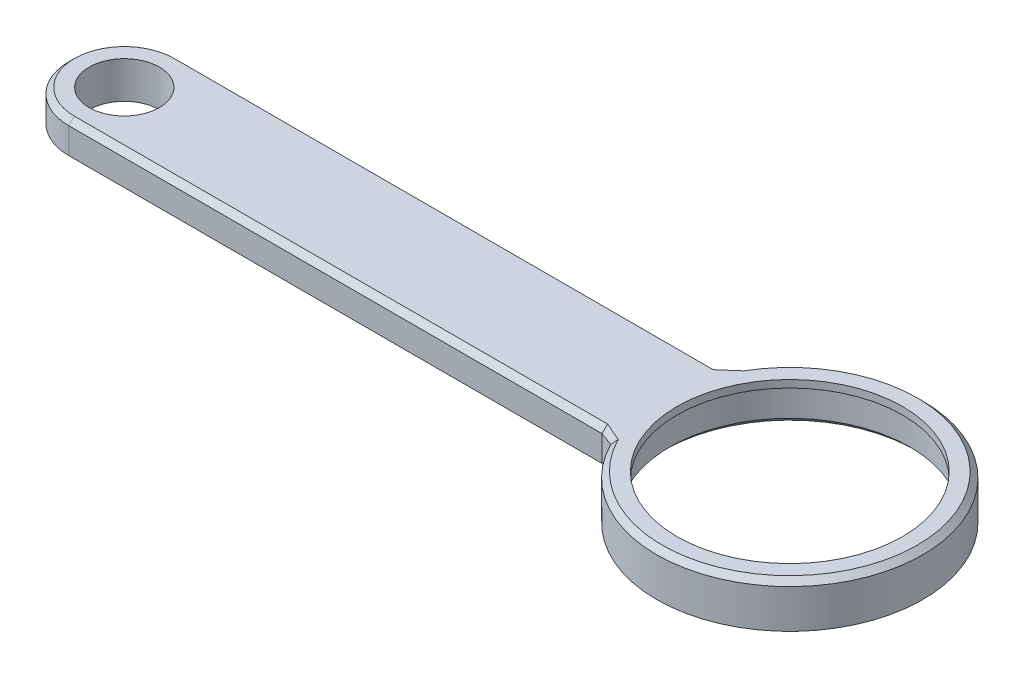
ISO-10303-21;
HEADER;
FILE_DESCRIPTION(('STEP AP214'),'2;1');
FILE_NAME('part.step','',(''),(''),'','','');
FILE_SCHEMA(('AUTOMOTIVE_DESIGN { 1 0 10303 214 1 1 1 1 }'));
ENDSEC;
DATA;
#1=APPLICATION_CONTEXT('core data for automotive mechanical design processes');
#2=APPLICATION_PROTOCOL_DEFINITION('international standard','automotive_design',2000,#1);
#3=PRODUCT_CONTEXT('',#1,'mechanical');
#4=PRODUCT('Part','Part','',(#3));
#5=PRODUCT_RELATED_PRODUCT_CATEGORY('part','',(#4));
#6=PRODUCT_DEFINITION_FORMATION('','',#4);
#7=PRODUCT_DEFINITION_CONTEXT('part definition',#1,'design');
#8=PRODUCT_DEFINITION('design','',#6,#7);
#9=PRODUCT_DEFINITION_SHAPE('','',#8);
#10=(LENGTH_UNIT() NAMED_UNIT(*) SI_UNIT(.MILLI.,.METRE.));
#11=(NAMED_UNIT(*) PLANE_ANGLE_UNIT() SI_UNIT($,.RADIAN.));
#12=(NAMED_UNIT(*) SI_UNIT($,.STERADIAN.) SOLID_ANGLE_UNIT());
#13=UNCERTAINTY_MEASURE_WITH_UNIT(LENGTH_MEASURE(1.E-05),#10,'distance_accuracy_value','');
#14=(GEOMETRIC_REPRESENTATION_CONTEXT(3) GLOBAL_UNCERTAINTY_ASSIGNED_CONTEXT((#13)) GLOBAL_UNIT_ASSIGNED_CONTEXT((#10,
#11,#12)) REPRESENTATION_CONTEXT('',''));
#15=CARTESIAN_POINT('',(0.,0.,0.));
#16=DIRECTION('',(0.,0.,1.));
#17=DIRECTION('',(1.,0.,0.));
#18=AXIS2_PLACEMENT_3D('',#15,#16,#17);
#19=CARTESIAN_POINT('',(0.,0.,0.));
#20=DIRECTION('',(0.,1.,0.));
#21=DIRECTION('',(0.,0.,1.));
#22=AXIS2_PLACEMENT_3D('',#19,#20,#21);
#23=PLANE('',#22);
#24=CARTESIAN_POINT('',(0.,0.,0.));
#25=DIRECTION('',(0.,1.,0.));
#26=DIRECTION('',(0.,0.,1.));
#27=AXIS2_PLACEMENT_3D('',#24,#25,#26);
#28=CIRCLE('',#27,30.5);
#29=CARTESIAN_POINT('',(0.,0.,30.5));
#30=VERTEX_POINT('',#29);
#31=EDGE_CURVE('E279',#30,#30,#28,.T.);
#32=ORIENTED_EDGE('',*,*,#31,.F.);
#33=EDGE_LOOP('',(#32));
#34=FACE_BOUND('',#33,.T.);
#35=CARTESIAN_POINT('',(-180.,0.,0.));
#36=DIRECTION('',(0.,-1.,0.));
#37=DIRECTION('',(0.,0.,-1.));
#38=AXIS2_PLACEMENT_3D('',#35,#36,#37);
#39=CIRCLE('',#38,9.50000000000001);
#40=CARTESIAN_POINT('',(-180.,0.,-9.50000000000001));
#41=VERTEX_POINT('',#40);
#42=EDGE_CURVE('E282',#41,#41,#39,.T.);
#43=ORIENTED_EDGE('',*,*,#42,.T.);
#44=EDGE_LOOP('',(#43));
#45=FACE_BOUND('',#44,.T.);
#46=CARTESIAN_POINT('',(-30.722120826462,0.,15.6971746478235));
#47=CARTESIAN_POINT('',(-31.3705232341037,0.,15.4150854460371));
#48=CARTESIAN_POINT('',(-32.0189256417454,0.,15.1329962442508));
#49=CARTESIAN_POINT('',(-33.1848542865295,0.,14.6257558687203));
#50=CARTESIAN_POINT('',(-33.7023805236719,0.,14.4006046949763));
#51=CARTESIAN_POINT('',(-34.7374329979568,0.,13.9503023474881));
#52=CARTESIAN_POINT('',(-35.2549592350992,0.,13.7251511737441));
#53=CARTESIAN_POINT('',(-35.7724854722417,0.,13.5));
#54=B_SPLINE_CURVE_WITH_KNOTS('',3,(#46,#47,#48,#49,#50,#51,#52,#53),.UNSPECIFIED.,.F.,.F.,(4,2,
2,4),(0.,2.12132034355963,3.81446478941247,5.50760923526531),.UNSPECIFIED.);
#55=CARTESIAN_POINT('',(-30.722120826462,0.,15.6971746478235));
#56=VERTEX_POINT('',#55);
#57=CARTESIAN_POINT('',(-35.7724854722417,0.,13.5));
#58=VERTEX_POINT('',#57);
#59=EDGE_CURVE('E219',#56,#58,#54,.T.);
#60=ORIENTED_EDGE('',*,*,#59,.F.);
#61=CARTESIAN_POINT('',(0.,0.,0.));
#62=DIRECTION('',(0.,1.,0.));
#63=DIRECTION('',(0.,0.,1.));
#64=AXIS2_PLACEMENT_3D('',#61,#62,#63);
#65=CIRCLE('',#64,34.5);
#66=CARTESIAN_POINT('',(-29.8127728455868,0.,-17.3622744839909));
#67=VERTEX_POINT('',#66);
#68=EDGE_CURVE('E182',#56,#67,#65,.T.);
#69=ORIENTED_EDGE('',*,*,#68,.T.);
#70=CARTESIAN_POINT('',(-34.2261363439071,0.,-13.5));
#71=CARTESIAN_POINT('',(-33.694019001971,0.,-13.9656727761108));
#72=CARTESIAN_POINT('',(-33.1619016600348,0.,-14.4313455522217));
#73=CARTESIAN_POINT('',(-32.1602824060133,0.,-15.3078943542756));
#74=CARTESIAN_POINT('',(-31.690780493928,0.,-15.7187703802187));
#75=CARTESIAN_POINT('',(-30.7517766697574,0.,-16.5405224321048));
#76=CARTESIAN_POINT('',(-30.2822747576721,0.,-16.9513984580478));
#77=CARTESIAN_POINT('',(-29.8127728455868,0.,-17.3622744839909));
#78=B_SPLINE_CURVE_WITH_KNOTS('',3,(#70,#71,#72,#73,#74,#75,#76,#77),.UNSPECIFIED.,.F.,.F.,(4,2,
2,4),(0.,2.12132034355963,3.99302020927494,5.86472007499024),.UNSPECIFIED.);
#79=CARTESIAN_POINT('',(-34.2261363439071,0.,-13.5));
#80=VERTEX_POINT('',#79);
#81=EDGE_CURVE('E174',#80,#67,#78,.T.);
#82=ORIENTED_EDGE('',*,*,#81,.F.);
#83=DIRECTION('',(-1.,0.,0.));
#84=VECTOR('',#83,1.);
#85=CARTESIAN_POINT('',(0.,0.,-13.5));
#86=LINE('',#85,#84);
#87=CARTESIAN_POINT('',(-180.,0.,-13.5));
#88=VERTEX_POINT('',#87);
#89=EDGE_CURVE('E170',#80,#88,#86,.T.);
#90=ORIENTED_EDGE('',*,*,#89,.T.);
#91=CARTESIAN_POINT('',(-180.,0.,0.));
#92=DIRECTION('',(0.,1.,0.));
#93=DIRECTION('',(0.,0.,1.));
#94=AXIS2_PLACEMENT_3D('',#91,#92,#93);
#95=CIRCLE('',#94,13.5);
#96=CARTESIAN_POINT('',(-180.,0.,13.5));
#97=VERTEX_POINT('',#96);
#98=EDGE_CURVE('E168',#88,#97,#95,.T.);
#99=ORIENTED_EDGE('',*,*,#98,.T.);
#100=DIRECTION('',(1.,0.,0.));
#101=VECTOR('',#100,1.);
#102=CARTESIAN_POINT('',(-32.7261363439072,0.,13.5));
#103=LINE('',#102,#101);
#104=EDGE_CURVE('E172',#97,#58,#103,.T.);
#105=ORIENTED_EDGE('',*,*,#104,.T.);
#106=EDGE_LOOP('',(#60,#69,#82,#90,#99,#105));
#107=FACE_BOUND('',#106,.T.);
#108=ADVANCED_FACE('F35',(#34,#45,#107),#23,.T.);
#109=CARTESIAN_POINT('',(0.,-12.,0.));
#110=DIRECTION('',(0.,1.,0.));
#111=DIRECTION('',(0.,0.,1.));
#112=AXIS2_PLACEMENT_3D('',#109,#110,#111);
#113=CYLINDRICAL_SURFACE('',#112,32.5);
#114=CARTESIAN_POINT('',(0.,-10.5,0.));
#115=DIRECTION('',(0.,1.,0.));
#116=DIRECTION('',(0.,0.,1.));
#117=AXIS2_PLACEMENT_3D('',#114,#115,#116);
#118=CIRCLE('',#117,32.5);
#119=CARTESIAN_POINT('',(0.,-10.5,32.5));
#120=VERTEX_POINT('',#119);
#121=EDGE_CURVE('E139',#120,#120,#118,.F.);
#122=ORIENTED_EDGE('',*,*,#121,.T.);
#123=EDGE_LOOP('',(#122));
#124=FACE_BOUND('',#123,.T.);
#125=CARTESIAN_POINT('',(0.,-2.,0.));
#126=DIRECTION('',(0.,1.,0.));
#127=DIRECTION('',(0.,0.,1.));
#128=AXIS2_PLACEMENT_3D('',#125,#126,#127);
#129=CIRCLE('',#128,32.5);
#130=CARTESIAN_POINT('',(0.,-2.,32.5));
#131=VERTEX_POINT('',#130);
#132=EDGE_CURVE('E266',#131,#131,#129,.F.);
#133=ORIENTED_EDGE('',*,*,#132,.F.);
#134=EDGE_LOOP('',(#133));
#135=FACE_BOUND('',#134,.T.);
#136=ADVANCED_FACE('F254',(#124,#135),#113,.F.);
#137=CARTESIAN_POINT('',(0.,-12.,0.));
#138=DIRECTION('',(0.,1.,0.));
#139=DIRECTION('',(0.,0.,1.));
#140=AXIS2_PLACEMENT_3D('',#137,#138,#139);
#141=CYLINDRICAL_SURFACE('',#140,36.);
#142=DIRECTION('',(0.,1.,0.));
#143=VECTOR('',#142,1.);
#144=CARTESIAN_POINT('',(-32.0578652102212,-12.,16.3796605020766));
#145=LINE('',#144,#143);
#146=CARTESIAN_POINT('',(-32.0578652102212,-1.49999999999999,16.3796605020766));
#147=VERTEX_POINT('',#146);
#148=CARTESIAN_POINT('',(-32.0578652102212,-8.50000000000005,16.3796605020766));
#149=VERTEX_POINT('',#148);
#150=EDGE_CURVE('E156',#147,#149,#145,.F.);
#151=ORIENTED_EDGE('',*,*,#150,.T.);
#152=CARTESIAN_POINT('',(-33.5862829143089,-11.5,12.96));
#153=CARTESIAN_POINT('',(-33.5410684863239,-11.392736175385,13.077176631379));
#154=CARTESIAN_POINT('',(-33.4950700651187,-11.2860277375744,13.1945553456316));
#155=CARTESIAN_POINT('',(-33.4015270439932,-11.073603734894,13.4295933773737));
#156=CARTESIAN_POINT('',(-33.3539824549919,-10.9678881630195,13.5472526928762));
#157=CARTESIAN_POINT('',(-33.209067784487,-10.6520660479296,13.9004525732165));
#158=CARTESIAN_POINT('',(-33.109410605324,-10.4432694570928,14.1362311428405));
#159=CARTESIAN_POINT('',(-32.9337685660963,-10.0885741633022,14.5396122951498));
#160=CARTESIAN_POINT('',(-32.8592686111205,-9.94194153432986,14.7072197800511));
#161=CARTESIAN_POINT('',(-32.7072423834577,-9.65007042795751,15.0422782999573));
#162=CARTESIAN_POINT('',(-32.6297161054663,-9.50483195300165,15.2097293346875));
#163=CARTESIAN_POINT('',(-32.4715758523081,-9.21556775937745,15.5444863999343));
#164=CARTESIAN_POINT('',(-32.3909594340746,-9.07154311486136,15.71179220413));
#165=CARTESIAN_POINT('',(-32.2266909870483,-8.78479939378795,16.0460297312259));
#166=CARTESIAN_POINT('',(-32.1430389784073,-8.64208030857155,16.2129614566016));
#167=CARTESIAN_POINT('',(-32.0578652102212,-8.50000000000005,16.3796605020766));
#168=B_SPLINE_CURVE_WITH_KNOTS('',3,(#152,#153,#154,#155,#156,#157,#158,#159,#160,#161,#162,
#163,#164,#165,#166,#167),.UNSPECIFIED.,.F.,.F.,(4,2,2,2,2,2,2,4),(0.,0.495494278602073,
0.990985058823317,1.98189880354024,2.68635853015757,3.39081949157547,4.09584937720495,
4.80087458335111),.UNSPECIFIED.);
#169=CARTESIAN_POINT('',(-33.5862829143089,-11.5,12.96));
#170=VERTEX_POINT('',#169);
#171=EDGE_CURVE('E11',#149,#170,#168,.F.);
#172=ORIENTED_EDGE('',*,*,#171,.T.);
#173=CARTESIAN_POINT('',(0.,-11.5,0.));
#174=DIRECTION('',(0.,1.,0.));
#175=DIRECTION('',(0.,0.,1.));
#176=AXIS2_PLACEMENT_3D('',#173,#174,#175);
#177=CIRCLE('',#176,36.);
#178=CARTESIAN_POINT('',(-33.5862829143089,-11.5,-12.96));
#179=VERTEX_POINT('',#178);
#180=EDGE_CURVE('E135',#170,#179,#177,.F.);
#181=ORIENTED_EDGE('',*,*,#180,.T.);
#182=CARTESIAN_POINT('',(-31.1089803606123,-8.50000000000005,-18.1171559832949));
#183=CARTESIAN_POINT('',(-31.1948702037618,-8.56894432587744,-17.969673892168));
#184=CARTESIAN_POINT('',(-31.2793041780734,-8.6398605177767,-17.822281373088));
#185=CARTESIAN_POINT('',(-31.4453159585936,-8.78534574171067,-17.5277119608742));
#186=CARTESIAN_POINT('',(-31.5268940441215,-8.85991441479449,-17.3805350480098));
#187=CARTESIAN_POINT('',(-31.7673145524915,-9.08855249171471,-16.9395923177207));
#188=CARTESIAN_POINT('',(-31.921990895601,-9.24767365011918,-16.6461604858364));
#189=CARTESIAN_POINT('',(-32.2154737721466,-9.57098242512484,-16.070590002093));
#190=CARTESIAN_POINT('',(-32.3546496645641,-9.73478657420342,-15.7884220401177));
#191=CARTESIAN_POINT('',(-32.6238606478111,-10.0704300966336,-15.2243688306687));
#192=CARTESIAN_POINT('',(-32.753892502502,-10.2422722792299,-14.9424837177417));
#193=CARTESIAN_POINT('',(-33.0058282877364,-10.5926709797618,-14.3774604015532));
#194=CARTESIAN_POINT('',(-33.1276971811896,-10.7712518640846,-14.0943217453431));
#195=CARTESIAN_POINT('',(-33.3042786204419,-11.0423691893371,-13.6692550452527));
#196=CARTESIAN_POINT('',(-33.3620858437266,-11.1332551104969,-13.5275485695506));
#197=CARTESIAN_POINT('',(-33.4756844414198,-11.3159639968427,-13.2439374428353));
#198=CARTESIAN_POINT('',(-33.5314758687067,-11.4077869373675,-13.1020327971222));
#199=CARTESIAN_POINT('',(-33.5862829143089,-11.5,-12.96));
#200=B_SPLINE_CURVE_WITH_KNOTS('',3,(#182,#183,#184,#185,#186,#187,#188,#189,#190,#191,#192,
#193,#194,#195,#196,#197,#198,#199),.UNSPECIFIED.,.F.,.F.,(4,2,2,2,2,2,2,2,4),(0.,
0.552169230993607,1.10428430550896,2.20756368242131,3.27146964481644,4.33575025549193,
5.40433959711795,5.9383166510914,6.47227968757327),.UNSPECIFIED.);
#201=CARTESIAN_POINT('',(-31.1089803606123,-8.50000000000005,-18.1171559832949));
#202=VERTEX_POINT('',#201);
#203=EDGE_CURVE('E128',#202,#179,#200,.T.);
#204=ORIENTED_EDGE('',*,*,#203,.F.);
#205=DIRECTION('',(0.,1.,0.));
#206=VECTOR('',#205,1.);
#207=CARTESIAN_POINT('',(-31.1089803606123,-12.,-18.1171559832949));
#208=LINE('',#207,#206);
#209=CARTESIAN_POINT('',(-31.1089803606123,-1.49999999999999,-18.1171559832949));
#210=VERTEX_POINT('',#209);
#211=EDGE_CURVE('E133',#202,#210,#208,.T.);
#212=ORIENTED_EDGE('',*,*,#211,.T.);
#213=CARTESIAN_POINT('',(0.,-1.49999999999999,0.));
#214=DIRECTION('',(0.,1.,0.));
#215=DIRECTION('',(0.,0.,1.));
#216=AXIS2_PLACEMENT_3D('',#213,#214,#215);
#217=CIRCLE('',#216,36.);
#218=EDGE_CURVE('E154',#210,#147,#217,.F.);
#219=ORIENTED_EDGE('',*,*,#218,.T.);
#220=EDGE_LOOP('',(#151,#172,#181,#204,#212,#219));
#221=FACE_BOUND('',#220,.T.);
#222=CARTESIAN_POINT('',(0.,-12.,0.));
#223=DIRECTION('',(0.,1.,0.));
#224=DIRECTION('',(0.,0.,1.));
#225=AXIS2_PLACEMENT_3D('',#222,#223,#224);
#226=CIRCLE('',#225,36.);
#227=CARTESIAN_POINT('',(0.,-12.,36.));
#228=VERTEX_POINT('',#227);
#229=EDGE_CURVE('E269',#228,#228,#226,.T.);
#230=ORIENTED_EDGE('',*,*,#229,.T.);
#231=EDGE_LOOP('',(#230));
#232=FACE_BOUND('',#231,.T.);
#233=ADVANCED_FACE('F130',(#221,#232),#141,.T.);
#234=CARTESIAN_POINT('',(0.,-12.,0.));
#235=DIRECTION('',(0.,1.,0.));
#236=DIRECTION('',(0.,0.,1.));
#237=AXIS2_PLACEMENT_3D('',#234,#235,#236);
#238=PLANE('',#237);
#239=CARTESIAN_POINT('',(0.,-12.,0.));
#240=DIRECTION('',(0.,1.,0.));
#241=DIRECTION('',(0.,0.,1.));
#242=AXIS2_PLACEMENT_3D('',#239,#240,#241);
#243=CIRCLE('',#242,34.);
#244=CARTESIAN_POINT('',(0.,-12.,34.));
#245=VERTEX_POINT('',#244);
#246=EDGE_CURVE('E263',#245,#245,#243,.T.);
#247=ORIENTED_EDGE('',*,*,#246,.T.);
#248=EDGE_LOOP('',(#247));
#249=FACE_BOUND('',#248,.T.);
#250=ORIENTED_EDGE('',*,*,#229,.F.);
#251=EDGE_LOOP('',(#250));
#252=FACE_BOUND('',#251,.T.);
#253=ADVANCED_FACE('F253',(#249,#252),#238,.F.);
#254=CARTESIAN_POINT('',(-32.7261363439071,-10.,15.));
#255=DIRECTION('',(0.,0.,-1.));
#256=DIRECTION('',(-1.,0.,0.));
#257=AXIS2_PLACEMENT_3D('',#254,#255,#256);
#258=PLANE('',#257);
#259=DIRECTION('',(0.,1.,0.));
#260=VECTOR('',#259,1.);
#261=CARTESIAN_POINT('',(-35.7724854722417,-10.,15.));
#262=LINE('',#261,#260);
#263=CARTESIAN_POINT('',(-35.7724854722417,-8.50000000000005,15.));
#264=VERTEX_POINT('',#263);
#265=CARTESIAN_POINT('',(-35.7724854722417,-1.49999999999999,15.));
#266=VERTEX_POINT('',#265);
#267=EDGE_CURVE('E228',#264,#266,#262,.T.);
#268=ORIENTED_EDGE('',*,*,#267,.T.);
#269=DIRECTION('',(-1.,0.,0.));
#270=VECTOR('',#269,1.);
#271=CARTESIAN_POINT('',(-180.,-1.49999999999999,15.));
#272=LINE('',#271,#270);
#273=CARTESIAN_POINT('',(-180.,-1.49999999999999,15.));
#274=VERTEX_POINT('',#273);
#275=EDGE_CURVE('E230',#266,#274,#272,.T.);
#276=ORIENTED_EDGE('',*,*,#275,.T.);
#277=DIRECTION('',(0.,1.,0.));
#278=VECTOR('',#277,1.);
#279=CARTESIAN_POINT('',(-180.,-10.,15.));
#280=LINE('',#279,#278);
#281=CARTESIAN_POINT('',(-180.,-8.50000000000005,15.));
#282=VERTEX_POINT('',#281);
#283=EDGE_CURVE('E272',#282,#274,#280,.T.);
#284=ORIENTED_EDGE('',*,*,#283,.F.);
#285=DIRECTION('',(1.,0.,0.));
#286=VECTOR('',#285,1.);
#287=CARTESIAN_POINT('',(-32.7261363439071,-8.50000000000005,15.));
#288=LINE('',#287,#286);
#289=EDGE_CURVE('E226',#282,#264,#288,.T.);
#290=ORIENTED_EDGE('',*,*,#289,.T.);
#291=EDGE_LOOP('',(#268,#276,#284,#290));
#292=FACE_BOUND('',#291,.T.);
#293=ADVANCED_FACE('F508',(#292),#258,.F.);
#294=CARTESIAN_POINT('',(-180.,-10.,0.));
#295=DIRECTION('',(0.,1.,0.));
#296=DIRECTION('',(0.,0.,1.));
#297=AXIS2_PLACEMENT_3D('',#294,#295,#296);
#298=CYLINDRICAL_SURFACE('',#297,15.);
#299=ORIENTED_EDGE('',*,*,#283,.T.);
#300=CARTESIAN_POINT('',(-180.,-1.49999999999999,0.));
#301=DIRECTION('',(0.,1.,0.));
#302=DIRECTION('',(0.,0.,1.));
#303=AXIS2_PLACEMENT_3D('',#300,#301,#302);
#304=CIRCLE('',#303,15.);
#305=CARTESIAN_POINT('',(-180.,-1.49999999999999,-15.));
#306=VERTEX_POINT('',#305);
#307=EDGE_CURVE('E234',#274,#306,#304,.F.);
#308=ORIENTED_EDGE('',*,*,#307,.T.);
#309=DIRECTION('',(0.,1.,0.));
#310=VECTOR('',#309,1.);
#311=CARTESIAN_POINT('',(-180.,-10.,-15.));
#312=LINE('',#311,#310);
#313=CARTESIAN_POINT('',(-180.,-8.50000000000005,-15.));
#314=VERTEX_POINT('',#313);
#315=EDGE_CURVE('E275',#314,#306,#312,.T.);
#316=ORIENTED_EDGE('',*,*,#315,.F.);
#317=CARTESIAN_POINT('',(-180.,-8.50000000000005,0.));
#318=DIRECTION('',(0.,1.,0.));
#319=DIRECTION('',(0.,0.,1.));
#320=AXIS2_PLACEMENT_3D('',#317,#318,#319);
#321=CIRCLE('',#320,15.);
#322=EDGE_CURVE('E232',#314,#282,#321,.T.);
#323=ORIENTED_EDGE('',*,*,#322,.T.);
#324=EDGE_LOOP('',(#299,#308,#316,#323));
#325=FACE_BOUND('',#324,.T.);
#326=ADVANCED_FACE('F312',(#325),#298,.T.);
#327=CARTESIAN_POINT('',(-32.7261363439071,-10.,-15.));
#328=DIRECTION('',(0.,0.,-1.));
#329=DIRECTION('',(-1.,0.,0.));
#330=AXIS2_PLACEMENT_3D('',#327,#328,#329);
#331=PLANE('',#330);
#332=ORIENTED_EDGE('',*,*,#315,.T.);
#333=DIRECTION('',(1.,0.,0.));
#334=VECTOR('',#333,1.);
#335=CARTESIAN_POINT('',(-32.7261363439071,-1.49999999999999,-15.));
#336=LINE('',#335,#334);
#337=CARTESIAN_POINT('',(-34.2261363439071,-1.49999999999999,-15.));
#338=VERTEX_POINT('',#337);
#339=EDGE_CURVE('E166',#306,#338,#336,.T.);
#340=ORIENTED_EDGE('',*,*,#339,.T.);
#341=DIRECTION('',(0.,-1.,0.));
#342=VECTOR('',#341,1.);
#343=CARTESIAN_POINT('',(-34.2261363439071,-10.,-15.));
#344=LINE('',#343,#342);
#345=CARTESIAN_POINT('',(-34.2261363439071,-8.50000000000005,-15.));
#346=VERTEX_POINT('',#345);
#347=EDGE_CURVE('E163',#338,#346,#344,.T.);
#348=ORIENTED_EDGE('',*,*,#347,.T.);
#349=DIRECTION('',(-1.,0.,0.));
#350=VECTOR('',#349,1.);
#351=CARTESIAN_POINT('',(-180.,-8.50000000000005,-15.));
#352=LINE('',#351,#350);
#353=EDGE_CURVE('E161',#346,#314,#352,.T.);
#354=ORIENTED_EDGE('',*,*,#353,.T.);
#355=EDGE_LOOP('',(#332,#340,#348,#354));
#356=FACE_BOUND('',#355,.T.);
#357=ADVANCED_FACE('F304',(#356),#331,.T.);
#358=CARTESIAN_POINT('',(0.,-10.,0.));
#359=DIRECTION('',(0.,1.,0.));
#360=DIRECTION('',(0.,0.,1.));
#361=AXIS2_PLACEMENT_3D('',#358,#359,#360);
#362=PLANE('',#361);
#363=DIRECTION('',(-1.,0.,0.));
#364=VECTOR('',#363,1.);
#365=CARTESIAN_POINT('',(0.,-10.,13.5));
#366=LINE('',#365,#364);
#367=CARTESIAN_POINT('',(-34.9857113690718,-10.,13.5));
#368=VERTEX_POINT('',#367);
#369=CARTESIAN_POINT('',(-180.,-10.,13.5));
#370=VERTEX_POINT('',#369);
#371=EDGE_CURVE('E61',#368,#370,#366,.T.);
#372=ORIENTED_EDGE('',*,*,#371,.T.);
#373=CARTESIAN_POINT('',(-180.,-10.,0.));
#374=DIRECTION('',(0.,1.,0.));
#375=DIRECTION('',(0.,0.,1.));
#376=AXIS2_PLACEMENT_3D('',#373,#374,#375);
#377=CIRCLE('',#376,13.5);
#378=CARTESIAN_POINT('',(-180.,-10.,-13.5));
#379=VERTEX_POINT('',#378);
#380=EDGE_CURVE('E45',#370,#379,#377,.F.);
#381=ORIENTED_EDGE('',*,*,#380,.T.);
#382=DIRECTION('',(1.,0.,0.));
#383=VECTOR('',#382,1.);
#384=CARTESIAN_POINT('',(-32.7261363439071,-10.,-13.5));
#385=LINE('',#384,#383);
#386=CARTESIAN_POINT('',(-34.9857113690718,-10.,-13.5));
#387=VERTEX_POINT('',#386);
#388=EDGE_CURVE('E53',#379,#387,#385,.T.);
#389=ORIENTED_EDGE('',*,*,#388,.T.);
#390=CARTESIAN_POINT('',(0.,-10.,0.));
#391=DIRECTION('',(0.,1.,0.));
#392=DIRECTION('',(0.,0.,1.));
#393=AXIS2_PLACEMENT_3D('',#390,#391,#392);
#394=CIRCLE('',#393,37.5);
#395=EDGE_CURVE('E236',#387,#368,#394,.T.);
#396=ORIENTED_EDGE('',*,*,#395,.T.);
#397=EDGE_LOOP('',(#372,#381,#389,#396));
#398=FACE_BOUND('',#397,.T.);
#399=CARTESIAN_POINT('',(-180.,-10.,0.));
#400=DIRECTION('',(0.,-1.,0.));
#401=DIRECTION('',(0.,0.,-1.));
#402=AXIS2_PLACEMENT_3D('',#399,#400,#401);
#403=CIRCLE('',#402,9.50000000000001);
#404=CARTESIAN_POINT('',(-180.,-10.,-9.50000000000001));
#405=VERTEX_POINT('',#404);
#406=EDGE_CURVE('E285',#405,#405,#403,.T.);
#407=ORIENTED_EDGE('',*,*,#406,.F.);
#408=EDGE_LOOP('',(#407));
#409=FACE_BOUND('',#408,.T.);
#410=ADVANCED_FACE('F301',(#398,#409),#362,.F.);
#411=CARTESIAN_POINT('',(0.,-2.,0.));
#412=DIRECTION('',(0.,1.,0.));
#413=DIRECTION('',(0.,0.,1.));
#414=AXIS2_PLACEMENT_3D('',#411,#412,#413);
#415=PLANE('',#414);
#416=CARTESIAN_POINT('',(0.,-2.,0.));
#417=DIRECTION('',(0.,1.,0.));
#418=DIRECTION('',(0.,0.,1.));
#419=AXIS2_PLACEMENT_3D('',#416,#417,#418);
#420=CIRCLE('',#419,30.5);
#421=CARTESIAN_POINT('',(0.,-2.,30.5));
#422=VERTEX_POINT('',#421);
#423=EDGE_CURVE('E278',#422,#422,#420,.T.);
#424=ORIENTED_EDGE('',*,*,#423,.T.);
#425=EDGE_LOOP('',(#424));
#426=FACE_BOUND('',#425,.T.);
#427=ORIENTED_EDGE('',*,*,#132,.T.);
#428=EDGE_LOOP('',(#427));
#429=FACE_BOUND('',#428,.T.);
#430=ADVANCED_FACE('F303',(#426,#429),#415,.F.);
#431=CARTESIAN_POINT('',(0.,-2.,0.));
#432=DIRECTION('',(0.,1.,0.));
#433=DIRECTION('',(0.,0.,1.));
#434=AXIS2_PLACEMENT_3D('',#431,#432,#433);
#435=CYLINDRICAL_SURFACE('',#434,30.5);
#436=ORIENTED_EDGE('',*,*,#423,.F.);
#437=EDGE_LOOP('',(#436));
#438=FACE_BOUND('',#437,.T.);
#439=ORIENTED_EDGE('',*,*,#31,.T.);
#440=EDGE_LOOP('',(#439));
#441=FACE_BOUND('',#440,.T.);
#442=ADVANCED_FACE('F297',(#438,#441),#435,.F.);
#443=CARTESIAN_POINT('',(-180.,0.,0.));
#444=DIRECTION('',(0.,-1.,0.));
#445=DIRECTION('',(0.,0.,-1.));
#446=AXIS2_PLACEMENT_3D('',#443,#444,#445);
#447=CYLINDRICAL_SURFACE('',#446,9.50000000000001);
#448=ORIENTED_EDGE('',*,*,#42,.F.);
#449=EDGE_LOOP('',(#448));
#450=FACE_BOUND('',#449,.T.);
#451=ORIENTED_EDGE('',*,*,#406,.T.);
#452=EDGE_LOOP('',(#451));
#453=FACE_BOUND('',#452,.T.);
#454=ADVANCED_FACE('F293',(#450,#453),#447,.F.);
#455=CARTESIAN_POINT('',(0.,-12.,0.));
#456=DIRECTION('',(0.,-1.,0.));
#457=DIRECTION('',(0.,0.,-1.));
#458=AXIS2_PLACEMENT_3D('',#455,#456,#457);
#459=CONICAL_SURFACE('',#458,34.,0.785398163397443);
#460=ORIENTED_EDGE('',*,*,#121,.F.);
#461=EDGE_LOOP('',(#460));
#462=FACE_BOUND('',#461,.T.);
#463=ORIENTED_EDGE('',*,*,#246,.F.);
#464=EDGE_LOOP('',(#463));
#465=FACE_BOUND('',#464,.T.);
#466=ADVANCED_FACE('F296',(#462,#465),#459,.F.);
#467=CARTESIAN_POINT('',(0.,-10.,13.5));
#468=DIRECTION('',(0.,0.707106781186552,-0.707106781186543));
#469=DIRECTION('',(-1.,0.,0.));
#470=AXIS2_PLACEMENT_3D('',#467,#468,#469);
#471=PLANE('',#470);
#472=CARTESIAN_POINT('',(-35.7724854722417,-8.50000000000005,15.));
#473=CARTESIAN_POINT('',(-35.6576565422715,-8.71892356937191,14.7810764306281));
#474=CARTESIAN_POINT('',(-35.5428276123013,-8.93784713874377,14.5621528612563));
#475=CARTESIAN_POINT('',(-35.3542841301212,-9.29730892342969,14.2026910765703));
#476=CARTESIAN_POINT('',(-35.2805695779113,-9.43784713874376,14.0621528612563));
#477=CARTESIAN_POINT('',(-35.1331404734915,-9.71892356937188,13.7810764306281));
#478=CARTESIAN_POINT('',(-35.0594259212817,-9.85946178468594,13.6405382153141));
#479=CARTESIAN_POINT('',(-34.9857113690718,-10.,13.5));
#480=B_SPLINE_CURVE_WITH_KNOTS('',3,(#472,#473,#474,#475,#476,#477,#478,#479),.UNSPECIFIED.,.F.,
.F.,(4,2,2,4),(0.,0.990639528032385,1.62658161361364,2.26252369919491),.UNSPECIFIED.);
#481=EDGE_CURVE('E612',#264,#368,#480,.T.);
#482=ORIENTED_EDGE('',*,*,#481,.F.);
#483=ORIENTED_EDGE('',*,*,#289,.F.);
#484=DIRECTION('',(0.,0.707106781186543,0.707106781186552));
#485=VECTOR('',#484,1.);
#486=CARTESIAN_POINT('',(-180.,-10.,13.5));
#487=LINE('',#486,#485);
#488=EDGE_CURVE('E40',#370,#282,#487,.T.);
#489=ORIENTED_EDGE('',*,*,#488,.F.);
#490=ORIENTED_EDGE('',*,*,#371,.F.);
#491=EDGE_LOOP('',(#482,#483,#489,#490));
#492=FACE_BOUND('',#491,.T.);
#493=ADVANCED_FACE('F345',(#492),#471,.F.);
#494=CARTESIAN_POINT('',(-35.7724854722417,-12.,15.));
#495=DIRECTION('',(0.348174200361495,0.,-0.937429851350294));
#496=DIRECTION('',(0.,1.,0.));
#497=AXIS2_PLACEMENT_3D('',#494,#495,#496);
#498=PLANE('',#497);
#499=CARTESIAN_POINT('',(-35.7724854722417,-1.49999999999999,15.));
#500=CARTESIAN_POINT('',(-35.4410539698534,-1.49999999999999,15.1230981690549));
#501=CARTESIAN_POINT('',(-35.1096224674652,-1.49999999999999,15.2461963381098));
#502=CARTESIAN_POINT('',(-34.4467594626887,-1.49999999999999,15.4923926762196));
#503=CARTESIAN_POINT('',(-34.1153279603005,-1.49999999999999,15.6154908452745));
#504=CARTESIAN_POINT('',(-33.2085527086819,-1.49999999999999,15.9522795102452));
#505=CARTESIAN_POINT('',(-32.6332089594515,-1.49999999999999,16.1659700061609));
#506=CARTESIAN_POINT('',(-32.0578652102212,-1.49999999999999,16.3796605020766));
#507=B_SPLINE_CURVE_WITH_KNOTS('',3,(#499,#500,#501,#502,#503,#504,#505,#506),.UNSPECIFIED.,.F.,
.F.,(4,2,2,4),(0.,1.06066017177982,2.12132034355964,3.96255811212953),.UNSPECIFIED.);
#508=EDGE_CURVE('E573',#266,#147,#507,.T.);
#509=ORIENTED_EDGE('',*,*,#508,.F.);
#510=ORIENTED_EDGE('',*,*,#267,.F.);
#511=DIRECTION('',(-0.937429851350294,0.,-0.348174200361495));
#512=VECTOR('',#511,1.);
#513=CARTESIAN_POINT('',(-32.0578652102212,-8.50000000000005,16.3796605020766));
#514=LINE('',#513,#512);
#515=EDGE_CURVE('E581',#149,#264,#514,.T.);
#516=ORIENTED_EDGE('',*,*,#515,.F.);
#517=ORIENTED_EDGE('',*,*,#150,.F.);
#518=EDGE_LOOP('',(#509,#510,#516,#517));
#519=FACE_BOUND('',#518,.T.);
#520=ADVANCED_FACE('F352',(#519),#498,.F.);
#521=CARTESIAN_POINT('',(-32.7261363439071,-1.49999999999999,15.));
#522=DIRECTION('',(0.,0.70710678118655,0.707106781186545));
#523=DIRECTION('',(1.,0.,0.));
#524=AXIS2_PLACEMENT_3D('',#521,#522,#523);
#525=PLANE('',#524);
#526=DIRECTION('',(0.,0.707106781186545,-0.70710678118655));
#527=VECTOR('',#526,1.);
#528=CARTESIAN_POINT('',(-180.,-1.49999999999999,15.));
#529=LINE('',#528,#527);
#530=EDGE_CURVE('E547',#274,#97,#529,.T.);
#531=ORIENTED_EDGE('',*,*,#530,.F.);
#532=ORIENTED_EDGE('',*,*,#275,.F.);
#533=DIRECTION('',(0.,-0.707106781186545,0.70710678118655));
#534=VECTOR('',#533,1.);
#535=CARTESIAN_POINT('',(-35.7724854722417,0.,13.5));
#536=LINE('',#535,#534);
#537=EDGE_CURVE('E551',#58,#266,#536,.T.);
#538=ORIENTED_EDGE('',*,*,#537,.F.);
#539=ORIENTED_EDGE('',*,*,#104,.F.);
#540=EDGE_LOOP('',(#531,#532,#538,#539));
#541=FACE_BOUND('',#540,.T.);
#542=ADVANCED_FACE('F38',(#541),#525,.T.);
#543=CARTESIAN_POINT('',(-180.,-8.50000000000005,0.));
#544=DIRECTION('',(0.,1.,0.));
#545=DIRECTION('',(0.,0.,1.));
#546=AXIS2_PLACEMENT_3D('',#543,#544,#545);
#547=CONICAL_SURFACE('',#546,15.,0.785398163397455);
#548=ORIENTED_EDGE('',*,*,#488,.T.);
#549=ORIENTED_EDGE('',*,*,#322,.F.);
#550=DIRECTION('',(0.,0.707106781186543,-0.707106781186552));
#551=VECTOR('',#550,1.);
#552=CARTESIAN_POINT('',(-180.,-10.,-13.5));
#553=LINE('',#552,#551);
#554=EDGE_CURVE('E552',#379,#314,#553,.T.);
#555=ORIENTED_EDGE('',*,*,#554,.F.);
#556=ORIENTED_EDGE('',*,*,#380,.F.);
#557=EDGE_LOOP('',(#548,#549,#555,#556));
#558=FACE_BOUND('',#557,.T.);
#559=ADVANCED_FACE('F367',(#558),#547,.T.);
#560=CARTESIAN_POINT('',(-35.7724854722417,-8.50000000000005,15.));
#561=CARTESIAN_POINT('',(-34.9857113690718,-10.,13.5));
#562=CARTESIAN_POINT('',(-32.0578652102212,-8.50000000000005,16.3796605020766));
#563=CARTESIAN_POINT('',(-33.5862829143089,-11.5,12.96));
#564=B_SPLINE_SURFACE_WITH_KNOTS('',1,1,((#560,#561),(#562,#563)),.UNSPECIFIED.,.F.,.F.,.F.,(2,
2),(2,2),(0.,1.),(0.,1.),.UNSPECIFIED.);
#565=DIRECTION('',(0.65969690009883,-0.707106781186543,-0.25455844122716));
#566=VECTOR('',#565,1.);
#567=CARTESIAN_POINT('',(-34.9857113690718,-10.,13.5));
#568=LINE('',#567,#566);
#569=EDGE_CURVE('E565',#170,#368,#568,.F.);
#570=ORIENTED_EDGE('',*,*,#515,.T.);
#571=ORIENTED_EDGE('',*,*,#481,.T.);
#572=ORIENTED_EDGE('',*,*,#569,.F.);
#573=ORIENTED_EDGE('',*,*,#171,.F.);
#574=EDGE_LOOP('',(#570,#571,#572,#573));
#575=FACE_BOUND('',#574,.T.);
#576=ADVANCED_FACE('F374',(#575),#564,.F.);
#577=CARTESIAN_POINT('',(-32.0578652102212,-1.49999999999999,16.3796605020766));
#578=CARTESIAN_POINT('',(-35.7724854722417,-1.49999999999999,15.));
#579=CARTESIAN_POINT('',(-30.722120826462,0.,15.6971746478235));
#580=CARTESIAN_POINT('',(-35.7724854722417,0.,13.5));
#581=B_SPLINE_SURFACE_WITH_KNOTS('',1,1,((#577,#578),(#579,#580)),.UNSPECIFIED.,.F.,.F.,.F.,(2,
2),(2,2),(0.,1.),(0.,1.),.UNSPECIFIED.);
#582=DIRECTION('',(0.629675941125328,0.707106781186545,-0.321726917070885));
#583=VECTOR('',#582,1.);
#584=CARTESIAN_POINT('',(-32.0578652102212,-1.49999999999999,16.3796605020766));
#585=LINE('',#584,#583);
#586=EDGE_CURVE('E559',#56,#147,#585,.F.);
#587=ORIENTED_EDGE('',*,*,#537,.T.);
#588=ORIENTED_EDGE('',*,*,#508,.T.);
#589=ORIENTED_EDGE('',*,*,#586,.F.);
#590=ORIENTED_EDGE('',*,*,#59,.T.);
#591=EDGE_LOOP('',(#587,#588,#589,#590));
#592=FACE_BOUND('',#591,.T.);
#593=ADVANCED_FACE('F381',(#592),#581,.T.);
#594=CARTESIAN_POINT('',(-180.,0.,0.));
#595=DIRECTION('',(0.,-1.,0.));
#596=DIRECTION('',(0.,0.,-1.));
#597=AXIS2_PLACEMENT_3D('',#594,#595,#596);
#598=CONICAL_SURFACE('',#597,13.5,0.785398163397452);
#599=ORIENTED_EDGE('',*,*,#530,.T.);
#600=ORIENTED_EDGE('',*,*,#98,.F.);
#601=DIRECTION('',(0.,0.707106781186545,0.70710678118655));
#602=VECTOR('',#601,1.);
#603=CARTESIAN_POINT('',(-180.,-1.49999999999999,-15.));
#604=LINE('',#603,#602);
#605=EDGE_CURVE('E556',#306,#88,#604,.T.);
#606=ORIENTED_EDGE('',*,*,#605,.F.);
#607=ORIENTED_EDGE('',*,*,#307,.F.);
#608=EDGE_LOOP('',(#599,#600,#606,#607));
#609=FACE_BOUND('',#608,.T.);
#610=ADVANCED_FACE('F389',(#609),#598,.T.);
#611=CARTESIAN_POINT('',(-32.7261363439071,-8.50000000000005,-15.));
#612=DIRECTION('',(0.,-0.707106781186552,-0.707106781186543));
#613=DIRECTION('',(1.,0.,0.));
#614=AXIS2_PLACEMENT_3D('',#611,#612,#613);
#615=PLANE('',#614);
#616=ORIENTED_EDGE('',*,*,#554,.T.);
#617=ORIENTED_EDGE('',*,*,#353,.F.);
#618=CARTESIAN_POINT('',(-34.9857113690718,-10.,-13.5));
#619=CARTESIAN_POINT('',(-34.922413450308,-9.87500000000001,-13.625));
#620=CARTESIAN_POINT('',(-34.8591155315443,-9.75000000000001,-13.75));
#621=CARTESIAN_POINT('',(-34.7325196940169,-9.50000000000002,-14.));
#622=CARTESIAN_POINT('',(-34.6692217752532,-9.37500000000002,-14.125));
#623=CARTESIAN_POINT('',(-34.479328018962,-9.00000000000003,-14.5));
#624=CARTESIAN_POINT('',(-34.3527321814346,-8.75000000000004,-14.75));
#625=CARTESIAN_POINT('',(-34.2261363439071,-8.50000000000005,-15.));
#626=B_SPLINE_CURVE_WITH_KNOTS('',3,(#618,#619,#620,#621,#622,#623,#624,#625),.UNSPECIFIED.,.F.,
.F.,(4,2,2,4),(0.,0.563302439794426,1.12660487958885,2.2532097591777),.UNSPECIFIED.);
#627=EDGE_CURVE('E144',#387,#346,#626,.T.);
#628=ORIENTED_EDGE('',*,*,#627,.F.);
#629=ORIENTED_EDGE('',*,*,#388,.F.);
#630=EDGE_LOOP('',(#616,#617,#628,#629));
#631=FACE_BOUND('',#630,.T.);
#632=ADVANCED_FACE('F397',(#631),#615,.T.);
#633=CARTESIAN_POINT('',(0.,-10.,0.));
#634=DIRECTION('',(0.,1.,0.));
#635=DIRECTION('',(0.,0.,1.));
#636=AXIS2_PLACEMENT_3D('',#633,#634,#635);
#637=CONICAL_SURFACE('',#636,37.5,0.785398163397455);
#638=ORIENTED_EDGE('',*,*,#569,.T.);
#639=ORIENTED_EDGE('',*,*,#395,.F.);
#640=DIRECTION('',(-0.65969690009883,0.707106781186543,-0.25455844122716));
#641=VECTOR('',#640,1.);
#642=CARTESIAN_POINT('',(-33.5862829143089,-11.5,-12.96));
#643=LINE('',#642,#641);
#644=EDGE_CURVE('E626',#179,#387,#643,.T.);
#645=ORIENTED_EDGE('',*,*,#644,.F.);
#646=ORIENTED_EDGE('',*,*,#180,.F.);
#647=EDGE_LOOP('',(#638,#639,#645,#646));
#648=FACE_BOUND('',#647,.T.);
#649=ADVANCED_FACE('F405',(#648),#637,.T.);
#650=CARTESIAN_POINT('',(0.,0.,0.));
#651=DIRECTION('',(0.,-1.,0.));
#652=DIRECTION('',(0.,0.,-1.));
#653=AXIS2_PLACEMENT_3D('',#650,#651,#652);
#654=CONICAL_SURFACE('',#653,34.5,0.785398163397452);
#655=ORIENTED_EDGE('',*,*,#586,.T.);
#656=ORIENTED_EDGE('',*,*,#218,.F.);
#657=DIRECTION('',(-0.611038082466339,-0.707106781186544,-0.355854551433397));
#658=VECTOR('',#657,1.);
#659=CARTESIAN_POINT('',(-29.8127728455868,0.,-17.3622744839909));
#660=LINE('',#659,#658);
#661=EDGE_CURVE('E628',#67,#210,#660,.T.);
#662=ORIENTED_EDGE('',*,*,#661,.F.);
#663=ORIENTED_EDGE('',*,*,#68,.F.);
#664=EDGE_LOOP('',(#655,#656,#662,#663));
#665=FACE_BOUND('',#664,.T.);
#666=ADVANCED_FACE('F412',(#665),#654,.T.);
#667=CARTESIAN_POINT('',(0.,0.,-13.5));
#668=DIRECTION('',(0.,-0.70710678118655,0.707106781186545));
#669=DIRECTION('',(-1.,0.,0.));
#670=AXIS2_PLACEMENT_3D('',#667,#668,#669);
#671=PLANE('',#670);
#672=ORIENTED_EDGE('',*,*,#605,.T.);
#673=ORIENTED_EDGE('',*,*,#89,.F.);
#674=DIRECTION('',(0.,0.707106781186545,0.70710678118655));
#675=VECTOR('',#674,1.);
#676=CARTESIAN_POINT('',(-34.2261363439071,-1.49999999999999,-15.));
#677=LINE('',#676,#675);
#678=EDGE_CURVE('E148',#338,#80,#677,.T.);
#679=ORIENTED_EDGE('',*,*,#678,.F.);
#680=ORIENTED_EDGE('',*,*,#339,.F.);
#681=EDGE_LOOP('',(#672,#673,#679,#680));
#682=FACE_BOUND('',#681,.T.);
#683=ADVANCED_FACE('F420',(#682),#671,.F.);
#684=CARTESIAN_POINT('',(-34.9857113690718,-10.,-13.5));
#685=CARTESIAN_POINT('',(-34.2261363439071,-8.50000000000005,-15.));
#686=CARTESIAN_POINT('',(-33.5862829143089,-11.5,-12.96));
#687=CARTESIAN_POINT('',(-31.1089803606123,-8.50000000000005,-18.1171559832949));
#688=B_SPLINE_SURFACE_WITH_KNOTS('',1,1,((#684,#685),(#686,#687)),.UNSPECIFIED.,.F.,.F.,.F.,(2,
2),(2,2),(0.,1.),(0.,1.),.UNSPECIFIED.);
#689=DIRECTION('',(0.707106781186542,0.,-0.707106781186553));
#690=VECTOR('',#689,1.);
#691=CARTESIAN_POINT('',(-34.2261363439071,-8.50000000000005,-15.));
#692=LINE('',#691,#690);
#693=EDGE_CURVE('E142',#202,#346,#692,.F.);
#694=ORIENTED_EDGE('',*,*,#644,.T.);
#695=ORIENTED_EDGE('',*,*,#627,.T.);
#696=ORIENTED_EDGE('',*,*,#693,.F.);
#697=ORIENTED_EDGE('',*,*,#203,.T.);
#698=EDGE_LOOP('',(#694,#695,#696,#697));
#699=FACE_BOUND('',#698,.T.);
#700=ADVANCED_FACE('F143',(#699),#688,.F.);
#701=CARTESIAN_POINT('',(-34.2261363439071,-1.49999999999999,-15.));
#702=CARTESIAN_POINT('',(-31.1089803606123,-1.49999999999999,-18.1171559832949));
#703=CARTESIAN_POINT('',(-34.2261363439071,0.,-13.5));
#704=CARTESIAN_POINT('',(-29.8127728455868,0.,-17.3622744839909));
#705=B_SPLINE_SURFACE_WITH_KNOTS('',1,1,((#701,#702),(#703,#704)),.UNSPECIFIED.,.F.,.F.,.F.,(2,
2),(2,2),(0.,1.),(0.,1.),.UNSPECIFIED.);
#706=CARTESIAN_POINT('',(-31.1089803606123,-1.49999999999999,-18.1171559832949));
#707=CARTESIAN_POINT('',(-31.3687433592202,-1.49999999999999,-17.857392984687));
#708=CARTESIAN_POINT('',(-31.6285063578281,-1.49999999999999,-17.5976299860791));
#709=CARTESIAN_POINT('',(-32.1480323550439,-1.49999999999999,-17.0781039888632));
#710=CARTESIAN_POINT('',(-32.4077953536518,-1.49999999999999,-16.8183409902553));
#711=CARTESIAN_POINT('',(-33.1870843494755,-1.49999999999999,-16.0390519944316));
#712=CARTESIAN_POINT('',(-33.7066103466913,-1.49999999999999,-15.5195259972158));
#713=CARTESIAN_POINT('',(-34.2261363439071,-1.49999999999999,-15.));
#714=B_SPLINE_CURVE_WITH_KNOTS('',3,(#706,#707,#708,#709,#710,#711,#712,#713),.UNSPECIFIED.,.F.,
.F.,(4,2,2,4),(0.,1.102081066902,2.20416213380401,4.40832426760801),.UNSPECIFIED.);
#715=EDGE_CURVE('E149',#338,#210,#714,.F.);
#716=ORIENTED_EDGE('',*,*,#81,.T.);
#717=ORIENTED_EDGE('',*,*,#661,.T.);
#718=ORIENTED_EDGE('',*,*,#715,.F.);
#719=ORIENTED_EDGE('',*,*,#678,.T.);
#720=EDGE_LOOP('',(#716,#717,#718,#719));
#721=FACE_BOUND('',#720,.T.);
#722=ADVANCED_FACE('F435',(#721),#705,.T.);
#723=CARTESIAN_POINT('',(-31.1089803606123,-12.,-18.1171559832949));
#724=DIRECTION('',(0.707106781186553,0.,0.707106781186542));
#725=DIRECTION('',(0.,1.,0.));
#726=AXIS2_PLACEMENT_3D('',#723,#724,#725);
#727=PLANE('',#726);
#728=ORIENTED_EDGE('',*,*,#693,.T.);
#729=ORIENTED_EDGE('',*,*,#347,.F.);
#730=ORIENTED_EDGE('',*,*,#715,.T.);
#731=ORIENTED_EDGE('',*,*,#211,.F.);
#732=EDGE_LOOP('',(#728,#729,#730,#731));
#733=FACE_BOUND('',#732,.T.);
#734=ADVANCED_FACE('F151',(#733),#727,.F.);
#735=CLOSED_SHELL('',(#108,#136,#233,#253,#293,#326,#357,#410,#430,#442,#454,#466,#493,#520,
#542,#559,#576,#593,#610,#632,#649,#666,#683,#700,#722,#734));
#736=MANIFOLD_SOLID_BREP('B2',#735);
#737=ADVANCED_BREP_SHAPE_REPRESENTATION('',(#18,#736),#14);
#738=SHAPE_DEFINITION_REPRESENTATION(#9,#737);
ENDSEC;
END-ISO-10303-21;
